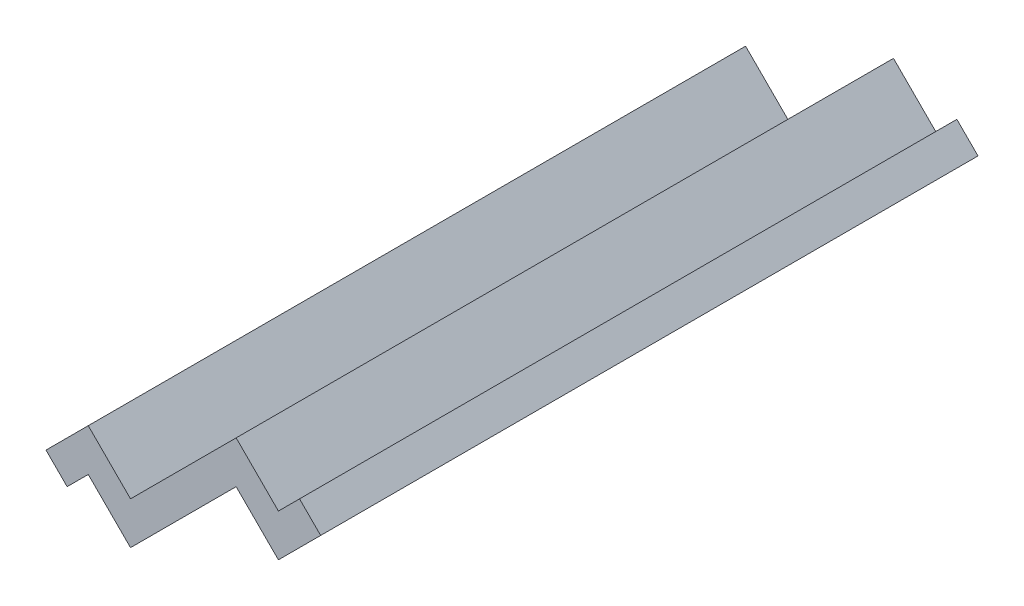
ISO-10303-21;
HEADER;
FILE_DESCRIPTION(('STEP AP214'),'2;1');
FILE_NAME('part.step','',(''),(''),'','','');
FILE_SCHEMA(('AUTOMOTIVE_DESIGN { 1 0 10303 214 1 1 1 1 }'));
ENDSEC;
DATA;
#1=APPLICATION_CONTEXT('core data for automotive mechanical design processes');
#2=APPLICATION_PROTOCOL_DEFINITION('international standard','automotive_design',2000,#1);
#3=PRODUCT_CONTEXT('',#1,'mechanical');
#4=PRODUCT('Part','Part','',(#3));
#5=PRODUCT_RELATED_PRODUCT_CATEGORY('part','',(#4));
#6=PRODUCT_DEFINITION_FORMATION('','',#4);
#7=PRODUCT_DEFINITION_CONTEXT('part definition',#1,'design');
#8=PRODUCT_DEFINITION('design','',#6,#7);
#9=PRODUCT_DEFINITION_SHAPE('','',#8);
#10=(LENGTH_UNIT() NAMED_UNIT(*) SI_UNIT(.MILLI.,.METRE.));
#11=(NAMED_UNIT(*) PLANE_ANGLE_UNIT() SI_UNIT($,.RADIAN.));
#12=(NAMED_UNIT(*) SI_UNIT($,.STERADIAN.) SOLID_ANGLE_UNIT());
#13=UNCERTAINTY_MEASURE_WITH_UNIT(LENGTH_MEASURE(1.E-05),#10,'distance_accuracy_value','');
#14=(GEOMETRIC_REPRESENTATION_CONTEXT(3) GLOBAL_UNCERTAINTY_ASSIGNED_CONTEXT((#13)) GLOBAL_UNIT_ASSIGNED_CONTEXT((#10,
#11,#12)) REPRESENTATION_CONTEXT('',''));
#15=CARTESIAN_POINT('',(0.,0.,0.));
#16=DIRECTION('',(0.,0.,1.));
#17=DIRECTION('',(1.,0.,0.));
#18=AXIS2_PLACEMENT_3D('',#15,#16,#17);
#19=CARTESIAN_POINT('',(17.6776695296637,17.6776695296636,220.));
#20=DIRECTION('',(0.707106781186548,0.707106781186547,0.));
#21=DIRECTION('',(-0.707106781186547,0.707106781186548,0.));
#22=AXIS2_PLACEMENT_3D('',#19,#20,#21);
#23=PLANE('',#22);
#24=DIRECTION('',(0.707106781186547,-0.707106781186548,0.));
#25=VECTOR('',#24,1.);
#26=CARTESIAN_POINT('',(17.6776695296637,17.6776695296636,0.));
#27=LINE('',#26,#25);
#28=CARTESIAN_POINT('',(17.6776695296637,17.6776695296636,0.));
#29=VERTEX_POINT('',#28);
#30=CARTESIAN_POINT('',(31.8198051533947,3.53553390593263,0.));
#31=VERTEX_POINT('',#30);
#32=EDGE_CURVE('E160',#29,#31,#27,.T.);
#33=ORIENTED_EDGE('',*,*,#32,.T.);
#34=DIRECTION('',(0.,0.,-1.));
#35=VECTOR('',#34,1.);
#36=CARTESIAN_POINT('',(31.8198051533947,3.53553390593263,220.));
#37=LINE('',#36,#35);
#38=CARTESIAN_POINT('',(31.8198051533947,3.53553390593263,220.));
#39=VERTEX_POINT('',#38);
#40=EDGE_CURVE('E43',#39,#31,#37,.T.);
#41=ORIENTED_EDGE('',*,*,#40,.F.);
#42=DIRECTION('',(0.707106781186547,-0.707106781186548,0.));
#43=VECTOR('',#42,1.);
#44=CARTESIAN_POINT('',(17.6776695296637,17.6776695296636,220.));
#45=LINE('',#44,#43);
#46=CARTESIAN_POINT('',(17.6776695296637,17.6776695296636,220.));
#47=VERTEX_POINT('',#46);
#48=EDGE_CURVE('E108',#47,#39,#45,.T.);
#49=ORIENTED_EDGE('',*,*,#48,.F.);
#50=DIRECTION('',(0.,0.,-1.));
#51=VECTOR('',#50,1.);
#52=CARTESIAN_POINT('',(17.6776695296637,17.6776695296636,220.));
#53=LINE('',#52,#51);
#54=EDGE_CURVE('E11',#47,#29,#53,.T.);
#55=ORIENTED_EDGE('',*,*,#54,.T.);
#56=EDGE_LOOP('',(#33,#41,#49,#55));
#57=FACE_BOUND('',#56,.T.);
#58=ADVANCED_FACE('F35',(#57),#23,.F.);
#59=CARTESIAN_POINT('',(31.8198051533947,3.53553390593263,220.));
#60=DIRECTION('',(-0.707106781186546,0.70710678118655,0.));
#61=DIRECTION('',(-0.70710678118655,-0.707106781186546,0.));
#62=AXIS2_PLACEMENT_3D('',#59,#60,#61);
#63=PLANE('',#62);
#64=DIRECTION('',(0.70710678118655,0.707106781186545,0.));
#65=VECTOR('',#64,1.);
#66=CARTESIAN_POINT('',(31.8198051533947,3.53553390593263,0.));
#67=LINE('',#66,#65);
#68=CARTESIAN_POINT('',(45.9619407771256,17.6776695296635,0.));
#69=VERTEX_POINT('',#68);
#70=EDGE_CURVE('E162',#31,#69,#67,.T.);
#71=ORIENTED_EDGE('',*,*,#70,.T.);
#72=DIRECTION('',(0.,0.,-1.));
#73=VECTOR('',#72,1.);
#74=CARTESIAN_POINT('',(45.9619407771256,17.6776695296635,220.));
#75=LINE('',#74,#73);
#76=CARTESIAN_POINT('',(45.9619407771256,17.6776695296635,220.));
#77=VERTEX_POINT('',#76);
#78=EDGE_CURVE('E200',#77,#69,#75,.T.);
#79=ORIENTED_EDGE('',*,*,#78,.F.);
#80=DIRECTION('',(0.70710678118655,0.707106781186545,0.));
#81=VECTOR('',#80,1.);
#82=CARTESIAN_POINT('',(31.8198051533947,3.53553390593263,220.));
#83=LINE('',#82,#81);
#84=EDGE_CURVE('E208',#39,#77,#83,.T.);
#85=ORIENTED_EDGE('',*,*,#84,.F.);
#86=ORIENTED_EDGE('',*,*,#40,.T.);
#87=EDGE_LOOP('',(#71,#79,#85,#86));
#88=FACE_BOUND('',#87,.T.);
#89=ADVANCED_FACE('F206',(#88),#63,.F.);
#90=CARTESIAN_POINT('',(38.8908729652602,24.748737341529,220.));
#91=DIRECTION('',(-0.707106781186547,-0.707106781186548,0.));
#92=DIRECTION('',(0.707106781186548,-0.707106781186547,0.));
#93=AXIS2_PLACEMENT_3D('',#90,#91,#92);
#94=PLANE('',#93);
#95=DIRECTION('',(-0.707106781186548,0.707106781186547,0.));
#96=VECTOR('',#95,1.);
#97=CARTESIAN_POINT('',(38.8908729652602,24.748737341529,0.));
#98=LINE('',#97,#96);
#99=CARTESIAN_POINT('',(38.8908729652602,24.748737341529,0.));
#100=VERTEX_POINT('',#99);
#101=EDGE_CURVE('E164',#69,#100,#98,.T.);
#102=ORIENTED_EDGE('',*,*,#101,.T.);
#103=DIRECTION('',(0.,0.,-1.));
#104=VECTOR('',#103,1.);
#105=CARTESIAN_POINT('',(38.8908729652602,24.748737341529,220.));
#106=LINE('',#105,#104);
#107=CARTESIAN_POINT('',(38.8908729652602,24.748737341529,220.));
#108=VERTEX_POINT('',#107);
#109=EDGE_CURVE('E197',#108,#100,#106,.T.);
#110=ORIENTED_EDGE('',*,*,#109,.F.);
#111=DIRECTION('',(-0.707106781186548,0.707106781186547,0.));
#112=VECTOR('',#111,1.);
#113=CARTESIAN_POINT('',(38.8908729652602,24.748737341529,220.));
#114=LINE('',#113,#112);
#115=EDGE_CURVE('E224',#77,#108,#114,.T.);
#116=ORIENTED_EDGE('',*,*,#115,.F.);
#117=ORIENTED_EDGE('',*,*,#78,.T.);
#118=EDGE_LOOP('',(#102,#110,#116,#117));
#119=FACE_BOUND('',#118,.T.);
#120=ADVANCED_FACE('F215',(#119),#94,.F.);
#121=CARTESIAN_POINT('',(31.8198051533947,17.6776695296635,220.));
#122=DIRECTION('',(0.707106781186548,-0.707106781186547,0.));
#123=DIRECTION('',(0.707106781186547,0.707106781186548,0.));
#124=AXIS2_PLACEMENT_3D('',#121,#122,#123);
#125=PLANE('',#124);
#126=DIRECTION('',(-0.707106781186547,-0.707106781186548,0.));
#127=VECTOR('',#126,1.);
#128=CARTESIAN_POINT('',(31.8198051533947,17.6776695296635,0.));
#129=LINE('',#128,#127);
#130=CARTESIAN_POINT('',(31.8198051533947,17.6776695296635,0.));
#131=VERTEX_POINT('',#130);
#132=EDGE_CURVE('E166',#100,#131,#129,.T.);
#133=ORIENTED_EDGE('',*,*,#132,.T.);
#134=DIRECTION('',(0.,0.,-1.));
#135=VECTOR('',#134,1.);
#136=CARTESIAN_POINT('',(31.8198051533947,17.6776695296635,220.));
#137=LINE('',#136,#135);
#138=CARTESIAN_POINT('',(31.8198051533947,17.6776695296635,220.));
#139=VERTEX_POINT('',#138);
#140=EDGE_CURVE('E194',#139,#131,#137,.T.);
#141=ORIENTED_EDGE('',*,*,#140,.F.);
#142=DIRECTION('',(-0.707106781186547,-0.707106781186548,0.));
#143=VECTOR('',#142,1.);
#144=CARTESIAN_POINT('',(31.8198051533947,17.6776695296635,220.));
#145=LINE('',#144,#143);
#146=EDGE_CURVE('E221',#108,#139,#145,.T.);
#147=ORIENTED_EDGE('',*,*,#146,.F.);
#148=ORIENTED_EDGE('',*,*,#109,.T.);
#149=EDGE_LOOP('',(#133,#141,#147,#148));
#150=FACE_BOUND('',#149,.T.);
#151=ADVANCED_FACE('F219',(#150),#125,.F.);
#152=CARTESIAN_POINT('',(31.8198051533947,17.6776695296635,220.));
#153=DIRECTION('',(-0.70710678118655,-0.707106781186545,0.));
#154=DIRECTION('',(0.707106781186545,-0.70710678118655,0.));
#155=AXIS2_PLACEMENT_3D('',#152,#153,#154);
#156=PLANE('',#155);
#157=DIRECTION('',(-0.707106781186545,0.70710678118655,0.));
#158=VECTOR('',#157,1.);
#159=CARTESIAN_POINT('',(31.8198051533947,17.6776695296635,0.));
#160=LINE('',#159,#158);
#161=CARTESIAN_POINT('',(17.6776695296638,31.8198051533945,0.));
#162=VERTEX_POINT('',#161);
#163=EDGE_CURVE('E168',#131,#162,#160,.T.);
#164=ORIENTED_EDGE('',*,*,#163,.T.);
#165=DIRECTION('',(0.,0.,-1.));
#166=VECTOR('',#165,1.);
#167=CARTESIAN_POINT('',(17.6776695296638,31.8198051533945,220.));
#168=LINE('',#167,#166);
#169=CARTESIAN_POINT('',(17.6776695296638,31.8198051533945,220.));
#170=VERTEX_POINT('',#169);
#171=EDGE_CURVE('E191',#170,#162,#168,.T.);
#172=ORIENTED_EDGE('',*,*,#171,.F.);
#173=DIRECTION('',(-0.707106781186545,0.70710678118655,0.));
#174=VECTOR('',#173,1.);
#175=CARTESIAN_POINT('',(31.8198051533947,17.6776695296635,220.));
#176=LINE('',#175,#174);
#177=EDGE_CURVE('E223',#139,#170,#176,.T.);
#178=ORIENTED_EDGE('',*,*,#177,.F.);
#179=ORIENTED_EDGE('',*,*,#140,.T.);
#180=EDGE_LOOP('',(#164,#172,#178,#179));
#181=FACE_BOUND('',#180,.T.);
#182=ADVANCED_FACE('F258',(#181),#156,.F.);
#183=CARTESIAN_POINT('',(-17.6776695296637,-3.53553390593267,220.));
#184=DIRECTION('',(0.707106781186545,-0.70710678118655,0.));
#185=DIRECTION('',(0.70710678118655,0.707106781186545,0.));
#186=AXIS2_PLACEMENT_3D('',#183,#184,#185);
#187=PLANE('',#186);
#188=DIRECTION('',(-0.70710678118655,-0.707106781186545,0.));
#189=VECTOR('',#188,1.);
#190=CARTESIAN_POINT('',(-17.6776695296637,-3.53553390593267,0.));
#191=LINE('',#190,#189);
#192=CARTESIAN_POINT('',(-17.6776695296637,-3.53553390593267,0.));
#193=VERTEX_POINT('',#192);
#194=EDGE_CURVE('E171',#162,#193,#191,.T.);
#195=ORIENTED_EDGE('',*,*,#194,.T.);
#196=DIRECTION('',(0.,0.,-1.));
#197=VECTOR('',#196,1.);
#198=CARTESIAN_POINT('',(-17.6776695296637,-3.53553390593267,220.));
#199=LINE('',#198,#197);
#200=CARTESIAN_POINT('',(-17.6776695296637,-3.53553390593267,220.));
#201=VERTEX_POINT('',#200);
#202=EDGE_CURVE('E188',#201,#193,#199,.T.);
#203=ORIENTED_EDGE('',*,*,#202,.F.);
#204=DIRECTION('',(-0.707106781186549,-0.707106781186546,0.));
#205=VECTOR('',#204,1.);
#206=CARTESIAN_POINT('',(17.6776695296638,31.8198051533945,220.));
#207=LINE('',#206,#205);
#208=EDGE_CURVE('E226',#170,#201,#207,.T.);
#209=ORIENTED_EDGE('',*,*,#208,.F.);
#210=ORIENTED_EDGE('',*,*,#171,.T.);
#211=EDGE_LOOP('',(#195,#203,#209,#210));
#212=FACE_BOUND('',#211,.T.);
#213=ADVANCED_FACE('F261',(#212),#187,.F.);
#214=CARTESIAN_POINT('',(-31.8198051533946,10.6066017177983,220.));
#215=DIRECTION('',(-0.70710678118655,-0.707106781186545,0.));
#216=DIRECTION('',(0.707106781186545,-0.70710678118655,0.));
#217=AXIS2_PLACEMENT_3D('',#214,#215,#216);
#218=PLANE('',#217);
#219=DIRECTION('',(-0.707106781186545,0.70710678118655,0.));
#220=VECTOR('',#219,1.);
#221=CARTESIAN_POINT('',(-31.8198051533946,10.6066017177983,0.));
#222=LINE('',#221,#220);
#223=CARTESIAN_POINT('',(-31.8198051533946,10.6066017177983,0.));
#224=VERTEX_POINT('',#223);
#225=EDGE_CURVE('E173',#193,#224,#222,.T.);
#226=ORIENTED_EDGE('',*,*,#225,.T.);
#227=DIRECTION('',(0.,0.,-1.));
#228=VECTOR('',#227,1.);
#229=CARTESIAN_POINT('',(-31.8198051533946,10.6066017177983,220.));
#230=LINE('',#229,#228);
#231=CARTESIAN_POINT('',(-31.8198051533946,10.6066017177983,220.));
#232=VERTEX_POINT('',#231);
#233=EDGE_CURVE('E185',#232,#224,#230,.T.);
#234=ORIENTED_EDGE('',*,*,#233,.F.);
#235=DIRECTION('',(-0.707106781186545,0.70710678118655,0.));
#236=VECTOR('',#235,1.);
#237=CARTESIAN_POINT('',(-31.8198051533946,10.6066017177983,220.));
#238=LINE('',#237,#236);
#239=EDGE_CURVE('E232',#201,#232,#238,.T.);
#240=ORIENTED_EDGE('',*,*,#239,.F.);
#241=ORIENTED_EDGE('',*,*,#202,.T.);
#242=EDGE_LOOP('',(#226,#234,#240,#241));
#243=FACE_BOUND('',#242,.T.);
#244=ADVANCED_FACE('F238',(#243),#218,.F.);
#245=CARTESIAN_POINT('',(-45.9619407771255,-3.53553390593251,220.));
#246=DIRECTION('',(0.707106781186545,-0.70710678118655,0.));
#247=DIRECTION('',(0.70710678118655,0.707106781186545,0.));
#248=AXIS2_PLACEMENT_3D('',#245,#246,#247);
#249=PLANE('',#248);
#250=DIRECTION('',(-0.70710678118655,-0.707106781186545,0.));
#251=VECTOR('',#250,1.);
#252=CARTESIAN_POINT('',(-45.9619407771255,-3.53553390593251,0.));
#253=LINE('',#252,#251);
#254=CARTESIAN_POINT('',(-45.9619407771255,-3.53553390593251,0.));
#255=VERTEX_POINT('',#254);
#256=EDGE_CURVE('E175',#224,#255,#253,.T.);
#257=ORIENTED_EDGE('',*,*,#256,.T.);
#258=DIRECTION('',(0.,0.,-1.));
#259=VECTOR('',#258,1.);
#260=CARTESIAN_POINT('',(-45.9619407771255,-3.53553390593251,220.));
#261=LINE('',#260,#259);
#262=CARTESIAN_POINT('',(-45.9619407771255,-3.53553390593251,220.));
#263=VERTEX_POINT('',#262);
#264=EDGE_CURVE('E149',#263,#255,#261,.T.);
#265=ORIENTED_EDGE('',*,*,#264,.F.);
#266=DIRECTION('',(-0.70710678118655,-0.707106781186545,0.));
#267=VECTOR('',#266,1.);
#268=CARTESIAN_POINT('',(-45.9619407771255,-3.53553390593251,220.));
#269=LINE('',#268,#267);
#270=EDGE_CURVE('E140',#232,#263,#269,.T.);
#271=ORIENTED_EDGE('',*,*,#270,.F.);
#272=ORIENTED_EDGE('',*,*,#233,.T.);
#273=EDGE_LOOP('',(#257,#265,#271,#272));
#274=FACE_BOUND('',#273,.T.);
#275=ADVANCED_FACE('F242',(#274),#249,.F.);
#276=CARTESIAN_POINT('',(-38.8908729652601,-10.606601717798,220.));
#277=DIRECTION('',(0.70710678118655,0.707106781186546,0.));
#278=DIRECTION('',(-0.707106781186546,0.70710678118655,0.));
#279=AXIS2_PLACEMENT_3D('',#276,#277,#278);
#280=PLANE('',#279);
#281=DIRECTION('',(0.707106781186546,-0.70710678118655,0.));
#282=VECTOR('',#281,1.);
#283=CARTESIAN_POINT('',(-38.8908729652601,-10.606601717798,0.));
#284=LINE('',#283,#282);
#285=CARTESIAN_POINT('',(-38.8908729652601,-10.606601717798,0.));
#286=VERTEX_POINT('',#285);
#287=EDGE_CURVE('E148',#255,#286,#284,.T.);
#288=ORIENTED_EDGE('',*,*,#287,.T.);
#289=DIRECTION('',(0.,0.,-1.));
#290=VECTOR('',#289,1.);
#291=CARTESIAN_POINT('',(-38.8908729652601,-10.606601717798,220.));
#292=LINE('',#291,#290);
#293=CARTESIAN_POINT('',(-38.8908729652601,-10.606601717798,220.));
#294=VERTEX_POINT('',#293);
#295=EDGE_CURVE('E145',#294,#286,#292,.T.);
#296=ORIENTED_EDGE('',*,*,#295,.F.);
#297=DIRECTION('',(0.707106781186546,-0.70710678118655,0.));
#298=VECTOR('',#297,1.);
#299=CARTESIAN_POINT('',(-38.8908729652601,-10.606601717798,220.));
#300=LINE('',#299,#298);
#301=EDGE_CURVE('E134',#263,#294,#300,.T.);
#302=ORIENTED_EDGE('',*,*,#301,.F.);
#303=ORIENTED_EDGE('',*,*,#264,.T.);
#304=EDGE_LOOP('',(#288,#296,#302,#303));
#305=FACE_BOUND('',#304,.T.);
#306=ADVANCED_FACE('F146',(#305),#280,.F.);
#307=CARTESIAN_POINT('',(-31.8198051533946,-3.53553390593255,220.));
#308=DIRECTION('',(-0.707106781186545,0.70710678118655,0.));
#309=DIRECTION('',(-0.70710678118655,-0.707106781186545,0.));
#310=AXIS2_PLACEMENT_3D('',#307,#308,#309);
#311=PLANE('',#310);
#312=DIRECTION('',(0.70710678118655,0.707106781186545,0.));
#313=VECTOR('',#312,1.);
#314=CARTESIAN_POINT('',(-31.8198051533946,-3.53553390593255,0.));
#315=LINE('',#314,#313);
#316=CARTESIAN_POINT('',(-31.8198051533946,-3.53553390593255,0.));
#317=VERTEX_POINT('',#316);
#318=EDGE_CURVE('E93',#286,#317,#315,.T.);
#319=ORIENTED_EDGE('',*,*,#318,.T.);
#320=DIRECTION('',(0.,0.,-1.));
#321=VECTOR('',#320,1.);
#322=CARTESIAN_POINT('',(-31.8198051533946,-3.53553390593255,220.));
#323=LINE('',#322,#321);
#324=CARTESIAN_POINT('',(-31.8198051533946,-3.53553390593255,220.));
#325=VERTEX_POINT('',#324);
#326=EDGE_CURVE('E150',#325,#317,#323,.T.);
#327=ORIENTED_EDGE('',*,*,#326,.F.);
#328=DIRECTION('',(0.70710678118655,0.707106781186545,0.));
#329=VECTOR('',#328,1.);
#330=CARTESIAN_POINT('',(-31.8198051533946,-3.53553390593255,220.));
#331=LINE('',#330,#329);
#332=EDGE_CURVE('E138',#294,#325,#331,.T.);
#333=ORIENTED_EDGE('',*,*,#332,.F.);
#334=ORIENTED_EDGE('',*,*,#295,.T.);
#335=EDGE_LOOP('',(#319,#327,#333,#334));
#336=FACE_BOUND('',#335,.T.);
#337=ADVANCED_FACE('F152',(#336),#311,.F.);
#338=CARTESIAN_POINT('',(-31.8198051533946,-3.53553390593255,220.));
#339=DIRECTION('',(0.70710678118655,0.707106781186545,0.));
#340=DIRECTION('',(-0.707106781186545,0.70710678118655,0.));
#341=AXIS2_PLACEMENT_3D('',#338,#339,#340);
#342=PLANE('',#341);
#343=DIRECTION('',(0.707106781186545,-0.70710678118655,0.));
#344=VECTOR('',#343,1.);
#345=CARTESIAN_POINT('',(-31.8198051533946,-3.53553390593255,0.));
#346=LINE('',#345,#344);
#347=CARTESIAN_POINT('',(-17.6776695296637,-17.6776695296636,0.));
#348=VERTEX_POINT('',#347);
#349=EDGE_CURVE('E179',#317,#348,#346,.T.);
#350=ORIENTED_EDGE('',*,*,#349,.T.);
#351=DIRECTION('',(0.,0.,-1.));
#352=VECTOR('',#351,1.);
#353=CARTESIAN_POINT('',(-17.6776695296637,-17.6776695296636,220.));
#354=LINE('',#353,#352);
#355=CARTESIAN_POINT('',(-17.6776695296637,-17.6776695296636,220.));
#356=VERTEX_POINT('',#355);
#357=EDGE_CURVE('E156',#356,#348,#354,.T.);
#358=ORIENTED_EDGE('',*,*,#357,.F.);
#359=DIRECTION('',(0.707106781186545,-0.70710678118655,0.));
#360=VECTOR('',#359,1.);
#361=CARTESIAN_POINT('',(-31.8198051533946,-3.53553390593255,220.));
#362=LINE('',#361,#360);
#363=EDGE_CURVE('E154',#325,#356,#362,.T.);
#364=ORIENTED_EDGE('',*,*,#363,.F.);
#365=ORIENTED_EDGE('',*,*,#326,.T.);
#366=EDGE_LOOP('',(#350,#358,#364,#365));
#367=FACE_BOUND('',#366,.T.);
#368=ADVANCED_FACE('F245',(#367),#342,.F.);
#369=CARTESIAN_POINT('',(0.,0.,220.));
#370=DIRECTION('',(-0.707106781186546,0.707106781186549,0.));
#371=DIRECTION('',(-0.707106781186549,-0.707106781186546,0.));
#372=AXIS2_PLACEMENT_3D('',#369,#370,#371);
#373=PLANE('',#372);
#374=DIRECTION('',(0.707106781186549,0.707106781186546,0.));
#375=VECTOR('',#374,1.);
#376=CARTESIAN_POINT('',(0.,0.,0.));
#377=LINE('',#376,#375);
#378=EDGE_CURVE('E100',#348,#29,#377,.T.);
#379=ORIENTED_EDGE('',*,*,#378,.T.);
#380=ORIENTED_EDGE('',*,*,#54,.F.);
#381=DIRECTION('',(0.707106781186549,0.707106781186546,0.));
#382=VECTOR('',#381,1.);
#383=CARTESIAN_POINT('',(0.,0.,220.));
#384=LINE('',#383,#382);
#385=EDGE_CURVE('E51',#356,#47,#384,.T.);
#386=ORIENTED_EDGE('',*,*,#385,.F.);
#387=ORIENTED_EDGE('',*,*,#357,.T.);
#388=EDGE_LOOP('',(#379,#380,#386,#387));
#389=FACE_BOUND('',#388,.T.);
#390=ADVANCED_FACE('F246',(#389),#373,.F.);
#391=CARTESIAN_POINT('',(0.,0.,220.));
#392=DIRECTION('',(0.,0.,-1.));
#393=DIRECTION('',(-1.,0.,0.));
#394=AXIS2_PLACEMENT_3D('',#391,#392,#393);
#395=PLANE('',#394);
#396=ORIENTED_EDGE('',*,*,#385,.T.);
#397=ORIENTED_EDGE('',*,*,#48,.T.);
#398=ORIENTED_EDGE('',*,*,#84,.T.);
#399=ORIENTED_EDGE('',*,*,#115,.T.);
#400=ORIENTED_EDGE('',*,*,#146,.T.);
#401=ORIENTED_EDGE('',*,*,#177,.T.);
#402=ORIENTED_EDGE('',*,*,#208,.T.);
#403=ORIENTED_EDGE('',*,*,#239,.T.);
#404=ORIENTED_EDGE('',*,*,#270,.T.);
#405=ORIENTED_EDGE('',*,*,#301,.T.);
#406=ORIENTED_EDGE('',*,*,#332,.T.);
#407=ORIENTED_EDGE('',*,*,#363,.T.);
#408=EDGE_LOOP('',(#396,#397,#398,#399,#400,#401,#402,#403,#404,#405,#406,#407));
#409=FACE_BOUND('',#408,.T.);
#410=ADVANCED_FACE('F136',(#409),#395,.F.);
#411=CARTESIAN_POINT('',(0.,0.,0.));
#412=DIRECTION('',(0.,0.,-1.));
#413=DIRECTION('',(-1.,0.,0.));
#414=AXIS2_PLACEMENT_3D('',#411,#412,#413);
#415=PLANE('',#414);
#416=ORIENTED_EDGE('',*,*,#32,.F.);
#417=ORIENTED_EDGE('',*,*,#378,.F.);
#418=ORIENTED_EDGE('',*,*,#349,.F.);
#419=ORIENTED_EDGE('',*,*,#318,.F.);
#420=ORIENTED_EDGE('',*,*,#287,.F.);
#421=ORIENTED_EDGE('',*,*,#256,.F.);
#422=ORIENTED_EDGE('',*,*,#225,.F.);
#423=ORIENTED_EDGE('',*,*,#194,.F.);
#424=ORIENTED_EDGE('',*,*,#163,.F.);
#425=ORIENTED_EDGE('',*,*,#132,.F.);
#426=ORIENTED_EDGE('',*,*,#101,.F.);
#427=ORIENTED_EDGE('',*,*,#70,.F.);
#428=EDGE_LOOP('',(#416,#417,#418,#419,#420,#421,#422,#423,#424,#425,#426,#427));
#429=FACE_BOUND('',#428,.T.);
#430=ADVANCED_FACE('F210',(#429),#415,.T.);
#431=CLOSED_SHELL('',(#58,#89,#120,#151,#182,#213,#244,#275,#306,#337,#368,#390,#410,#430));
#432=MANIFOLD_SOLID_BREP('B2',#431);
#433=ADVANCED_BREP_SHAPE_REPRESENTATION('',(#18,#432),#14);
#434=SHAPE_DEFINITION_REPRESENTATION(#9,#433);
ENDSEC;
END-ISO-10303-21;
